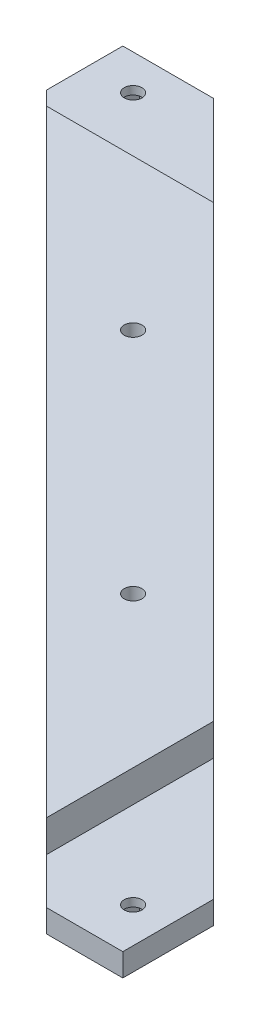
ISO-10303-21;
HEADER;
FILE_DESCRIPTION(('STEP AP214'),'2;1');
FILE_NAME('part.step','',(''),(''),'','','');
FILE_SCHEMA(('AUTOMOTIVE_DESIGN { 1 0 10303 214 1 1 1 1 }'));
ENDSEC;
DATA;
#1=APPLICATION_CONTEXT('core data for automotive mechanical design processes');
#2=APPLICATION_PROTOCOL_DEFINITION('international standard','automotive_design',2000,#1);
#3=PRODUCT_CONTEXT('',#1,'mechanical');
#4=PRODUCT('Part','Part','',(#3));
#5=PRODUCT_RELATED_PRODUCT_CATEGORY('part','',(#4));
#6=PRODUCT_DEFINITION_FORMATION('','',#4);
#7=PRODUCT_DEFINITION_CONTEXT('part definition',#1,'design');
#8=PRODUCT_DEFINITION('design','',#6,#7);
#9=PRODUCT_DEFINITION_SHAPE('','',#8);
#10=(LENGTH_UNIT() NAMED_UNIT(*) SI_UNIT(.MILLI.,.METRE.));
#11=(NAMED_UNIT(*) PLANE_ANGLE_UNIT() SI_UNIT($,.RADIAN.));
#12=(NAMED_UNIT(*) SI_UNIT($,.STERADIAN.) SOLID_ANGLE_UNIT());
#13=UNCERTAINTY_MEASURE_WITH_UNIT(LENGTH_MEASURE(1.E-05),#10,'distance_accuracy_value','');
#14=(GEOMETRIC_REPRESENTATION_CONTEXT(3) GLOBAL_UNCERTAINTY_ASSIGNED_CONTEXT((#13)) GLOBAL_UNIT_ASSIGNED_CONTEXT((#10,
#11,#12)) REPRESENTATION_CONTEXT('',''));
#15=CARTESIAN_POINT('',(0.,0.,0.));
#16=DIRECTION('',(0.,0.,1.));
#17=DIRECTION('',(1.,0.,0.));
#18=AXIS2_PLACEMENT_3D('',#15,#16,#17);
#19=CARTESIAN_POINT('',(0.,12.,0.));
#20=DIRECTION('',(1.,0.,0.));
#21=DIRECTION('',(0.,0.,-1.));
#22=AXIS2_PLACEMENT_3D('',#19,#20,#21);
#23=PLANE('',#22);
#24=DIRECTION('',(0.,1.,0.));
#25=VECTOR('',#24,1.);
#26=CARTESIAN_POINT('',(0.,-310.675688797775,0.25));
#27=LINE('',#26,#25);
#28=CARTESIAN_POINT('',(0.,0.,0.25));
#29=VERTEX_POINT('',#28);
#30=CARTESIAN_POINT('',(0.,5.,0.25));
#31=VERTEX_POINT('',#30);
#32=EDGE_CURVE('E207',#29,#31,#27,.T.);
#33=ORIENTED_EDGE('',*,*,#32,.F.);
#34=DIRECTION('',(0.,0.,1.));
#35=VECTOR('',#34,1.);
#36=CARTESIAN_POINT('',(0.,0.,0.));
#37=LINE('',#36,#35);
#38=CARTESIAN_POINT('',(0.,0.,17.));
#39=VERTEX_POINT('',#38);
#40=EDGE_CURVE('E402',#29,#39,#37,.T.);
#41=ORIENTED_EDGE('',*,*,#40,.T.);
#42=DIRECTION('',(0.,-1.,0.));
#43=VECTOR('',#42,1.);
#44=CARTESIAN_POINT('',(0.,12.,17.));
#45=LINE('',#44,#43);
#46=CARTESIAN_POINT('',(0.,5.,17.));
#47=VERTEX_POINT('',#46);
#48=EDGE_CURVE('E419',#47,#39,#45,.T.);
#49=ORIENTED_EDGE('',*,*,#48,.F.);
#50=DIRECTION('',(0.,0.,1.));
#51=VECTOR('',#50,1.);
#52=CARTESIAN_POINT('',(0.,5.,0.));
#53=LINE('',#52,#51);
#54=EDGE_CURVE('E364',#31,#47,#53,.T.);
#55=ORIENTED_EDGE('',*,*,#54,.F.);
#56=EDGE_LOOP('',(#33,#41,#49,#55));
#57=FACE_BOUND('',#56,.T.);
#58=ADVANCED_FACE('F38',(#57),#23,.F.);
#59=CARTESIAN_POINT('',(0.,12.,0.));
#60=DIRECTION('',(0.,1.,0.));
#61=DIRECTION('',(0.,0.,1.));
#62=AXIS2_PLACEMENT_3D('',#59,#60,#61);
#63=PLANE('',#62);
#64=CARTESIAN_POINT('',(62.0000000000002,12.,60.));
#65=DIRECTION('',(0.,1.,0.));
#66=DIRECTION('',(0.,0.,1.));
#67=AXIS2_PLACEMENT_3D('',#64,#65,#66);
#68=CIRCLE('',#67,1.95);
#69=CARTESIAN_POINT('',(62.0000000000002,12.,61.95));
#70=VERTEX_POINT('',#69);
#71=EDGE_CURVE('E354',#70,#70,#68,.T.);
#72=ORIENTED_EDGE('',*,*,#71,.F.);
#73=EDGE_LOOP('',(#72));
#74=FACE_BOUND('',#73,.T.);
#75=CARTESIAN_POINT('',(112.,12.,110.));
#76=DIRECTION('',(0.,1.,0.));
#77=DIRECTION('',(0.,0.,1.));
#78=AXIS2_PLACEMENT_3D('',#75,#76,#77);
#79=CIRCLE('',#78,1.95);
#80=CARTESIAN_POINT('',(112.,12.,111.95));
#81=VERTEX_POINT('',#80);
#82=EDGE_CURVE('E359',#81,#81,#79,.T.);
#83=ORIENTED_EDGE('',*,*,#82,.F.);
#84=EDGE_LOOP('',(#83));
#85=FACE_BOUND('',#84,.T.);
#86=DIRECTION('',(0.,0.,1.));
#87=VECTOR('',#86,1.);
#88=CARTESIAN_POINT('',(145.,12.,171.999999999999));
#89=LINE('',#88,#87);
#90=CARTESIAN_POINT('',(145.,12.,125.353553390593));
#91=VERTEX_POINT('',#90);
#92=CARTESIAN_POINT('',(145.,12.,161.999999999999));
#93=VERTEX_POINT('',#92);
#94=EDGE_CURVE('E380',#91,#93,#89,.T.);
#95=ORIENTED_EDGE('',*,*,#94,.F.);
#96=DIRECTION('',(-0.707106781186549,0.,-0.707106781186546));
#97=VECTOR('',#96,1.);
#98=CARTESIAN_POINT('',(9.82322330470332,12.,-9.82322330470336));
#99=LINE('',#98,#97);
#100=CARTESIAN_POINT('',(46.6464466094068,12.,27.));
#101=VERTEX_POINT('',#100);
#102=EDGE_CURVE('E453',#91,#101,#99,.T.);
#103=ORIENTED_EDGE('',*,*,#102,.T.);
#104=DIRECTION('',(1.,0.,0.));
#105=VECTOR('',#104,1.);
#106=CARTESIAN_POINT('',(0.,12.,27.));
#107=LINE('',#106,#105);
#108=CARTESIAN_POINT('',(10.0000000000001,12.,27.));
#109=VERTEX_POINT('',#108);
#110=EDGE_CURVE('E368',#109,#101,#107,.T.);
#111=ORIENTED_EDGE('',*,*,#110,.F.);
#112=DIRECTION('',(0.707106781186549,0.,0.707106781186546));
#113=VECTOR('',#112,1.);
#114=CARTESIAN_POINT('',(0.,12.,17.));
#115=LINE('',#114,#113);
#116=EDGE_CURVE('E403',#109,#93,#115,.T.);
#117=ORIENTED_EDGE('',*,*,#116,.T.);
#118=EDGE_LOOP('',(#95,#103,#111,#117));
#119=FACE_BOUND('',#118,.T.);
#120=ADVANCED_FACE('F466',(#74,#85,#119),#63,.T.);
#121=CARTESIAN_POINT('',(0.,0.,0.));
#122=DIRECTION('',(0.,1.,0.));
#123=DIRECTION('',(0.,0.,1.));
#124=AXIS2_PLACEMENT_3D('',#121,#122,#123);
#125=PLANE('',#124);
#126=CARTESIAN_POINT('',(112.,0.,110.));
#127=DIRECTION('',(0.,1.,0.));
#128=DIRECTION('',(0.,0.,1.));
#129=AXIS2_PLACEMENT_3D('',#126,#127,#128);
#130=CIRCLE('',#129,1.95);
#131=CARTESIAN_POINT('',(112.,0.,111.95));
#132=VERTEX_POINT('',#131);
#133=EDGE_CURVE('E358',#132,#132,#130,.F.);
#134=ORIENTED_EDGE('',*,*,#133,.F.);
#135=EDGE_LOOP('',(#134));
#136=FACE_BOUND('',#135,.T.);
#137=CARTESIAN_POINT('',(62.0000000000002,0.,60.));
#138=DIRECTION('',(0.,1.,0.));
#139=DIRECTION('',(0.,0.,1.));
#140=AXIS2_PLACEMENT_3D('',#137,#138,#139);
#141=CIRCLE('',#140,1.95);
#142=CARTESIAN_POINT('',(62.0000000000002,0.,61.95));
#143=VERTEX_POINT('',#142);
#144=EDGE_CURVE('E386',#143,#143,#141,.F.);
#145=ORIENTED_EDGE('',*,*,#144,.F.);
#146=EDGE_LOOP('',(#145));
#147=FACE_BOUND('',#146,.T.);
#148=DIRECTION('',(-0.5,0.,0.866025403784439));
#149=VECTOR('',#148,1.);
#150=CARTESIAN_POINT('',(167.983716857408,0.,161.999999999999));
#151=LINE('',#150,#149);
#152=CARTESIAN_POINT('',(167.983716857409,0.,161.999999999999));
#153=VERTEX_POINT('',#152);
#154=CARTESIAN_POINT('',(165.991858428704,0.,165.449999999999));
#155=VERTEX_POINT('',#154);
#156=EDGE_CURVE('E318',#153,#155,#151,.T.);
#157=ORIENTED_EDGE('',*,*,#156,.F.);
#158=DIRECTION('',(0.500000000000002,0.,0.866025403784437));
#159=VECTOR('',#158,1.);
#160=CARTESIAN_POINT('',(165.991858428704,0.,158.549999999999));
#161=LINE('',#160,#159);
#162=CARTESIAN_POINT('',(165.991858428704,0.,158.549999999999));
#163=VERTEX_POINT('',#162);
#164=EDGE_CURVE('E223',#163,#153,#161,.T.);
#165=ORIENTED_EDGE('',*,*,#164,.F.);
#166=DIRECTION('',(1.,0.,0.));
#167=VECTOR('',#166,1.);
#168=CARTESIAN_POINT('',(162.008141571296,0.,158.549999999999));
#169=LINE('',#168,#167);
#170=CARTESIAN_POINT('',(162.008141571296,0.,158.549999999999));
#171=VERTEX_POINT('',#170);
#172=EDGE_CURVE('E295',#171,#163,#169,.T.);
#173=ORIENTED_EDGE('',*,*,#172,.F.);
#174=DIRECTION('',(0.499999999999998,0.,-0.86602540378444));
#175=VECTOR('',#174,1.);
#176=CARTESIAN_POINT('',(160.016283142592,0.,161.999999999999));
#177=LINE('',#176,#175);
#178=CARTESIAN_POINT('',(160.016283142592,0.,161.999999999999));
#179=VERTEX_POINT('',#178);
#180=EDGE_CURVE('E330',#179,#171,#177,.T.);
#181=ORIENTED_EDGE('',*,*,#180,.F.);
#182=DIRECTION('',(-0.499999999999999,0.,-0.866025403784439));
#183=VECTOR('',#182,1.);
#184=CARTESIAN_POINT('',(162.008141571296,0.,165.449999999999));
#185=LINE('',#184,#183);
#186=CARTESIAN_POINT('',(162.008141571296,0.,165.449999999999));
#187=VERTEX_POINT('',#186);
#188=EDGE_CURVE('E326',#187,#179,#185,.T.);
#189=ORIENTED_EDGE('',*,*,#188,.F.);
#190=DIRECTION('',(-1.,0.,0.));
#191=VECTOR('',#190,1.);
#192=CARTESIAN_POINT('',(165.991858428704,0.,165.449999999999));
#193=LINE('',#192,#191);
#194=EDGE_CURVE('E322',#155,#187,#193,.T.);
#195=ORIENTED_EDGE('',*,*,#194,.F.);
#196=EDGE_LOOP('',(#157,#165,#173,#181,#189,#195));
#197=FACE_BOUND('',#196,.T.);
#198=DIRECTION('',(-0.5,0.,0.866025403784439));
#199=VECTOR('',#198,1.);
#200=CARTESIAN_POINT('',(13.9837168574084,0.,8.));
#201=LINE('',#200,#199);
#202=CARTESIAN_POINT('',(13.9837168574084,0.,8.));
#203=VERTEX_POINT('',#202);
#204=CARTESIAN_POINT('',(11.9918584287042,0.,11.45));
#205=VERTEX_POINT('',#204);
#206=EDGE_CURVE('E252',#203,#205,#201,.T.);
#207=ORIENTED_EDGE('',*,*,#206,.F.);
#208=DIRECTION('',(0.5,0.,0.866025403784439));
#209=VECTOR('',#208,1.);
#210=CARTESIAN_POINT('',(11.9918584287042,0.,4.55));
#211=LINE('',#210,#209);
#212=CARTESIAN_POINT('',(11.9918584287042,0.,4.55));
#213=VERTEX_POINT('',#212);
#214=EDGE_CURVE('E61',#213,#203,#211,.T.);
#215=ORIENTED_EDGE('',*,*,#214,.F.);
#216=DIRECTION('',(1.,0.,0.));
#217=VECTOR('',#216,1.);
#218=CARTESIAN_POINT('',(8.00814157129579,0.,4.55));
#219=LINE('',#218,#217);
#220=CARTESIAN_POINT('',(8.00814157129579,0.,4.55));
#221=VERTEX_POINT('',#220);
#222=EDGE_CURVE('E229',#221,#213,#219,.T.);
#223=ORIENTED_EDGE('',*,*,#222,.F.);
#224=DIRECTION('',(0.5,0.,-0.866025403784439));
#225=VECTOR('',#224,1.);
#226=CARTESIAN_POINT('',(6.01628314259158,0.,8.));
#227=LINE('',#226,#225);
#228=CARTESIAN_POINT('',(6.01628314259158,0.,8.));
#229=VERTEX_POINT('',#228);
#230=EDGE_CURVE('E265',#229,#221,#227,.T.);
#231=ORIENTED_EDGE('',*,*,#230,.F.);
#232=DIRECTION('',(-0.5,0.,-0.866025403784439));
#233=VECTOR('',#232,1.);
#234=CARTESIAN_POINT('',(8.00814157129579,0.,11.45));
#235=LINE('',#234,#233);
#236=CARTESIAN_POINT('',(8.00814157129579,0.,11.45));
#237=VERTEX_POINT('',#236);
#238=EDGE_CURVE('E261',#237,#229,#235,.T.);
#239=ORIENTED_EDGE('',*,*,#238,.F.);
#240=DIRECTION('',(-1.,0.,0.));
#241=VECTOR('',#240,1.);
#242=CARTESIAN_POINT('',(11.9918584287042,0.,11.45));
#243=LINE('',#242,#241);
#244=EDGE_CURVE('E257',#205,#237,#243,.T.);
#245=ORIENTED_EDGE('',*,*,#244,.F.);
#246=EDGE_LOOP('',(#207,#215,#223,#231,#239,#245));
#247=FACE_BOUND('',#246,.T.);
#248=DIRECTION('',(0.,0.,-1.));
#249=VECTOR('',#248,1.);
#250=CARTESIAN_POINT('',(171.75,0.,0.));
#251=LINE('',#250,#249);
#252=CARTESIAN_POINT('',(171.75,0.,171.999999999999));
#253=VERTEX_POINT('',#252);
#254=CARTESIAN_POINT('',(171.75,0.,152.103553390593));
#255=VERTEX_POINT('',#254);
#256=EDGE_CURVE('E187',#253,#255,#251,.T.);
#257=ORIENTED_EDGE('',*,*,#256,.F.);
#258=DIRECTION('',(1.,0.,0.));
#259=VECTOR('',#258,1.);
#260=CARTESIAN_POINT('',(155.,0.,171.999999999999));
#261=LINE('',#260,#259);
#262=CARTESIAN_POINT('',(155.,0.,171.999999999999));
#263=VERTEX_POINT('',#262);
#264=EDGE_CURVE('E408',#263,#253,#261,.T.);
#265=ORIENTED_EDGE('',*,*,#264,.F.);
#266=DIRECTION('',(0.707106781186549,0.,0.707106781186546));
#267=VECTOR('',#266,1.);
#268=CARTESIAN_POINT('',(0.,0.,17.));
#269=LINE('',#268,#267);
#270=EDGE_CURVE('E411',#39,#263,#269,.T.);
#271=ORIENTED_EDGE('',*,*,#270,.F.);
#272=ORIENTED_EDGE('',*,*,#40,.F.);
#273=DIRECTION('',(-1.,0.,0.));
#274=VECTOR('',#273,1.);
#275=CARTESIAN_POINT('',(0.,0.,0.25));
#276=LINE('',#275,#274);
#277=CARTESIAN_POINT('',(19.8964466094067,0.,0.25));
#278=VERTEX_POINT('',#277);
#279=EDGE_CURVE('E199',#278,#29,#276,.T.);
#280=ORIENTED_EDGE('',*,*,#279,.F.);
#281=DIRECTION('',(-0.707106781186549,0.,-0.707106781186546));
#282=VECTOR('',#281,1.);
#283=CARTESIAN_POINT('',(9.82322330470332,0.,-9.82322330470336));
#284=LINE('',#283,#282);
#285=EDGE_CURVE('E200',#255,#278,#284,.T.);
#286=ORIENTED_EDGE('',*,*,#285,.F.);
#287=EDGE_LOOP('',(#257,#265,#271,#272,#280,#286));
#288=FACE_BOUND('',#287,.T.);
#289=ADVANCED_FACE('F210',(#136,#147,#197,#247,#288),#125,.F.);
#290=CARTESIAN_POINT('',(0.,5.,27.));
#291=DIRECTION('',(0.,0.,1.));
#292=DIRECTION('',(1.,0.,0.));
#293=AXIS2_PLACEMENT_3D('',#290,#291,#292);
#294=PLANE('',#293);
#295=DIRECTION('',(0.,1.,0.));
#296=VECTOR('',#295,1.);
#297=CARTESIAN_POINT('',(46.6464466094068,5.,27.));
#298=LINE('',#297,#296);
#299=CARTESIAN_POINT('',(46.6464466094068,5.,27.));
#300=VERTEX_POINT('',#299);
#301=EDGE_CURVE('E217',#300,#101,#298,.T.);
#302=ORIENTED_EDGE('',*,*,#301,.F.);
#303=DIRECTION('',(1.,0.,0.));
#304=VECTOR('',#303,1.);
#305=CARTESIAN_POINT('',(0.,5.,27.));
#306=LINE('',#305,#304);
#307=CARTESIAN_POINT('',(10.0000000000001,5.,27.));
#308=VERTEX_POINT('',#307);
#309=EDGE_CURVE('E367',#308,#300,#306,.T.);
#310=ORIENTED_EDGE('',*,*,#309,.F.);
#311=DIRECTION('',(0.,-1.,0.));
#312=VECTOR('',#311,1.);
#313=CARTESIAN_POINT('',(10.0000000000001,12.,27.));
#314=LINE('',#313,#312);
#315=EDGE_CURVE('E398',#109,#308,#314,.T.);
#316=ORIENTED_EDGE('',*,*,#315,.F.);
#317=ORIENTED_EDGE('',*,*,#110,.T.);
#318=EDGE_LOOP('',(#302,#310,#316,#317));
#319=FACE_BOUND('',#318,.T.);
#320=ADVANCED_FACE('F468',(#319),#294,.F.);
#321=CARTESIAN_POINT('',(0.,5.,0.));
#322=DIRECTION('',(0.,1.,0.));
#323=DIRECTION('',(0.,0.,1.));
#324=AXIS2_PLACEMENT_3D('',#321,#322,#323);
#325=PLANE('',#324);
#326=CARTESIAN_POINT('',(10.,5.,8.));
#327=DIRECTION('',(0.,1.,0.));
#328=DIRECTION('',(0.,0.,1.));
#329=AXIS2_PLACEMENT_3D('',#326,#327,#328);
#330=CIRCLE('',#329,1.95);
#331=CARTESIAN_POINT('',(10.,5.,9.95));
#332=VERTEX_POINT('',#331);
#333=EDGE_CURVE('E372',#332,#332,#330,.F.);
#334=ORIENTED_EDGE('',*,*,#333,.T.);
#335=EDGE_LOOP('',(#334));
#336=FACE_BOUND('',#335,.T.);
#337=ORIENTED_EDGE('',*,*,#309,.T.);
#338=DIRECTION('',(-0.707106781186549,0.,-0.707106781186546));
#339=VECTOR('',#338,1.);
#340=CARTESIAN_POINT('',(9.82322330470332,5.,-9.82322330470336));
#341=LINE('',#340,#339);
#342=CARTESIAN_POINT('',(19.8964466094067,5.,0.25));
#343=VERTEX_POINT('',#342);
#344=EDGE_CURVE('E213',#300,#343,#341,.T.);
#345=ORIENTED_EDGE('',*,*,#344,.T.);
#346=DIRECTION('',(-1.,0.,0.));
#347=VECTOR('',#346,1.);
#348=CARTESIAN_POINT('',(0.,5.,0.25));
#349=LINE('',#348,#347);
#350=EDGE_CURVE('E11',#343,#31,#349,.T.);
#351=ORIENTED_EDGE('',*,*,#350,.T.);
#352=ORIENTED_EDGE('',*,*,#54,.T.);
#353=DIRECTION('',(0.707106781186549,0.,0.707106781186546));
#354=VECTOR('',#353,1.);
#355=CARTESIAN_POINT('',(0.,5.,17.));
#356=LINE('',#355,#354);
#357=EDGE_CURVE('E387',#47,#308,#356,.T.);
#358=ORIENTED_EDGE('',*,*,#357,.T.);
#359=EDGE_LOOP('',(#337,#345,#351,#352,#358));
#360=FACE_BOUND('',#359,.T.);
#361=ADVANCED_FACE('F478',(#336,#360),#325,.T.);
#362=CARTESIAN_POINT('',(145.,5.,171.999999999999));
#363=DIRECTION('',(-1.,0.,0.));
#364=DIRECTION('',(0.,0.,1.));
#365=AXIS2_PLACEMENT_3D('',#362,#363,#364);
#366=PLANE('',#365);
#367=DIRECTION('',(0.,-1.,0.));
#368=VECTOR('',#367,1.);
#369=CARTESIAN_POINT('',(145.,5.,125.353553390593));
#370=LINE('',#369,#368);
#371=CARTESIAN_POINT('',(145.,5.,125.353553390593));
#372=VERTEX_POINT('',#371);
#373=EDGE_CURVE('E53',#91,#372,#370,.T.);
#374=ORIENTED_EDGE('',*,*,#373,.F.);
#375=ORIENTED_EDGE('',*,*,#94,.T.);
#376=DIRECTION('',(0.,1.,0.));
#377=VECTOR('',#376,1.);
#378=CARTESIAN_POINT('',(145.,12.,161.999999999999));
#379=LINE('',#378,#377);
#380=CARTESIAN_POINT('',(145.,5.,161.999999999999));
#381=VERTEX_POINT('',#380);
#382=EDGE_CURVE('E394',#381,#93,#379,.T.);
#383=ORIENTED_EDGE('',*,*,#382,.F.);
#384=DIRECTION('',(0.,0.,1.));
#385=VECTOR('',#384,1.);
#386=CARTESIAN_POINT('',(145.,5.,171.999999999999));
#387=LINE('',#386,#385);
#388=EDGE_CURVE('E377',#372,#381,#387,.T.);
#389=ORIENTED_EDGE('',*,*,#388,.F.);
#390=EDGE_LOOP('',(#374,#375,#383,#389));
#391=FACE_BOUND('',#390,.T.);
#392=ADVANCED_FACE('F476',(#391),#366,.F.);
#393=CARTESIAN_POINT('',(0.,5.,0.));
#394=DIRECTION('',(0.,1.,0.));
#395=DIRECTION('',(0.,0.,1.));
#396=AXIS2_PLACEMENT_3D('',#393,#394,#395);
#397=PLANE('',#396);
#398=CARTESIAN_POINT('',(164.,5.,161.999999999999));
#399=DIRECTION('',(0.,1.,0.));
#400=DIRECTION('',(0.,0.,1.));
#401=AXIS2_PLACEMENT_3D('',#398,#399,#400);
#402=CIRCLE('',#401,1.95);
#403=CARTESIAN_POINT('',(164.,5.,163.949999999999));
#404=VERTEX_POINT('',#403);
#405=EDGE_CURVE('E390',#404,#404,#402,.F.);
#406=ORIENTED_EDGE('',*,*,#405,.T.);
#407=EDGE_LOOP('',(#406));
#408=FACE_BOUND('',#407,.T.);
#409=DIRECTION('',(1.,0.,0.));
#410=VECTOR('',#409,1.);
#411=CARTESIAN_POINT('',(172.,5.,171.999999999999));
#412=LINE('',#411,#410);
#413=CARTESIAN_POINT('',(155.,5.,171.999999999999));
#414=VERTEX_POINT('',#413);
#415=CARTESIAN_POINT('',(171.75,5.,171.999999999999));
#416=VERTEX_POINT('',#415);
#417=EDGE_CURVE('E376',#414,#416,#412,.T.);
#418=ORIENTED_EDGE('',*,*,#417,.T.);
#419=DIRECTION('',(0.,0.,-1.));
#420=VECTOR('',#419,1.);
#421=CARTESIAN_POINT('',(171.75,5.,0.));
#422=LINE('',#421,#420);
#423=CARTESIAN_POINT('',(171.75,5.,152.103553390593));
#424=VERTEX_POINT('',#423);
#425=EDGE_CURVE('E46',#416,#424,#422,.T.);
#426=ORIENTED_EDGE('',*,*,#425,.T.);
#427=DIRECTION('',(-0.707106781186549,0.,-0.707106781186546));
#428=VECTOR('',#427,1.);
#429=CARTESIAN_POINT('',(9.82322330470332,5.,-9.82322330470336));
#430=LINE('',#429,#428);
#431=EDGE_CURVE('E205',#424,#372,#430,.T.);
#432=ORIENTED_EDGE('',*,*,#431,.T.);
#433=ORIENTED_EDGE('',*,*,#388,.T.);
#434=DIRECTION('',(0.707106781186549,0.,0.707106781186546));
#435=VECTOR('',#434,1.);
#436=CARTESIAN_POINT('',(0.,5.,17.));
#437=LINE('',#436,#435);
#438=EDGE_CURVE('E391',#381,#414,#437,.T.);
#439=ORIENTED_EDGE('',*,*,#438,.T.);
#440=EDGE_LOOP('',(#418,#426,#432,#433,#439));
#441=FACE_BOUND('',#440,.T.);
#442=ADVANCED_FACE('F444',(#408,#441),#397,.T.);
#443=CARTESIAN_POINT('',(164.,0.,161.999999999999));
#444=DIRECTION('',(0.,1.,0.));
#445=DIRECTION('',(0.,0.,1.));
#446=AXIS2_PLACEMENT_3D('',#443,#444,#445);
#447=CYLINDRICAL_SURFACE('',#446,1.95);
#448=ORIENTED_EDGE('',*,*,#405,.F.);
#449=EDGE_LOOP('',(#448));
#450=FACE_BOUND('',#449,.T.);
#451=CARTESIAN_POINT('',(164.,3.2,161.999999999999));
#452=DIRECTION('',(0.,-1.,0.));
#453=DIRECTION('',(0.,0.,-1.));
#454=AXIS2_PLACEMENT_3D('',#451,#452,#453);
#455=CIRCLE('',#454,1.95);
#456=CARTESIAN_POINT('',(164.,3.2,160.049999999999));
#457=VERTEX_POINT('',#456);
#458=EDGE_CURVE('E363',#457,#457,#455,.F.);
#459=ORIENTED_EDGE('',*,*,#458,.F.);
#460=EDGE_LOOP('',(#459));
#461=FACE_BOUND('',#460,.T.);
#462=ADVANCED_FACE('F484',(#450,#461),#447,.F.);
#463=CARTESIAN_POINT('',(10.,0.,8.));
#464=DIRECTION('',(0.,1.,0.));
#465=DIRECTION('',(0.,0.,1.));
#466=AXIS2_PLACEMENT_3D('',#463,#464,#465);
#467=CYLINDRICAL_SURFACE('',#466,1.95);
#468=ORIENTED_EDGE('',*,*,#333,.F.);
#469=EDGE_LOOP('',(#468));
#470=FACE_BOUND('',#469,.T.);
#471=CARTESIAN_POINT('',(10.,3.2,8.));
#472=DIRECTION('',(0.,-1.,0.));
#473=DIRECTION('',(0.,0.,-1.));
#474=AXIS2_PLACEMENT_3D('',#471,#472,#473);
#475=CIRCLE('',#474,1.95);
#476=CARTESIAN_POINT('',(10.,3.2,6.05));
#477=VERTEX_POINT('',#476);
#478=EDGE_CURVE('E275',#477,#477,#475,.F.);
#479=ORIENTED_EDGE('',*,*,#478,.F.);
#480=EDGE_LOOP('',(#479));
#481=FACE_BOUND('',#480,.T.);
#482=ADVANCED_FACE('F593',(#470,#481),#467,.F.);
#483=CARTESIAN_POINT('',(155.,12.,171.999999999999));
#484=DIRECTION('',(0.,0.,-1.));
#485=DIRECTION('',(-1.,0.,0.));
#486=AXIS2_PLACEMENT_3D('',#483,#484,#485);
#487=PLANE('',#486);
#488=ORIENTED_EDGE('',*,*,#264,.T.);
#489=DIRECTION('',(0.,1.,0.));
#490=VECTOR('',#489,1.);
#491=CARTESIAN_POINT('',(171.75,-310.675688797775,171.999999999999));
#492=LINE('',#491,#490);
#493=EDGE_CURVE('E193',#253,#416,#492,.T.);
#494=ORIENTED_EDGE('',*,*,#493,.T.);
#495=ORIENTED_EDGE('',*,*,#417,.F.);
#496=DIRECTION('',(0.,-1.,0.));
#497=VECTOR('',#496,1.);
#498=CARTESIAN_POINT('',(155.,12.,171.999999999999));
#499=LINE('',#498,#497);
#500=EDGE_CURVE('E407',#414,#263,#499,.T.);
#501=ORIENTED_EDGE('',*,*,#500,.T.);
#502=EDGE_LOOP('',(#488,#494,#495,#501));
#503=FACE_BOUND('',#502,.T.);
#504=ADVANCED_FACE('F448',(#503),#487,.F.);
#505=CARTESIAN_POINT('',(0.,12.,17.));
#506=DIRECTION('',(0.707106781186546,0.,-0.707106781186549));
#507=DIRECTION('',(-0.707106781186549,0.,-0.707106781186546));
#508=AXIS2_PLACEMENT_3D('',#505,#506,#507);
#509=PLANE('',#508);
#510=ORIENTED_EDGE('',*,*,#116,.F.);
#511=ORIENTED_EDGE('',*,*,#315,.T.);
#512=ORIENTED_EDGE('',*,*,#357,.F.);
#513=ORIENTED_EDGE('',*,*,#48,.T.);
#514=ORIENTED_EDGE('',*,*,#270,.T.);
#515=ORIENTED_EDGE('',*,*,#500,.F.);
#516=ORIENTED_EDGE('',*,*,#438,.F.);
#517=ORIENTED_EDGE('',*,*,#382,.T.);
#518=EDGE_LOOP('',(#510,#511,#512,#513,#514,#515,#516,#517));
#519=FACE_BOUND('',#518,.T.);
#520=ADVANCED_FACE('F471',(#519),#509,.F.);
#521=CARTESIAN_POINT('',(112.,12.,110.));
#522=DIRECTION('',(0.,-1.,0.));
#523=DIRECTION('',(0.,0.,-1.));
#524=AXIS2_PLACEMENT_3D('',#521,#522,#523);
#525=CYLINDRICAL_SURFACE('',#524,1.95);
#526=ORIENTED_EDGE('',*,*,#82,.T.);
#527=EDGE_LOOP('',(#526));
#528=FACE_BOUND('',#527,.T.);
#529=ORIENTED_EDGE('',*,*,#133,.T.);
#530=EDGE_LOOP('',(#529));
#531=FACE_BOUND('',#530,.T.);
#532=ADVANCED_FACE('F575',(#528,#531),#525,.F.);
#533=CARTESIAN_POINT('',(62.0000000000002,12.,60.));
#534=DIRECTION('',(0.,-1.,0.));
#535=DIRECTION('',(0.,0.,-1.));
#536=AXIS2_PLACEMENT_3D('',#533,#534,#535);
#537=CYLINDRICAL_SURFACE('',#536,1.95);
#538=ORIENTED_EDGE('',*,*,#71,.T.);
#539=EDGE_LOOP('',(#538));
#540=FACE_BOUND('',#539,.T.);
#541=ORIENTED_EDGE('',*,*,#144,.T.);
#542=EDGE_LOOP('',(#541));
#543=FACE_BOUND('',#542,.T.);
#544=ADVANCED_FACE('F549',(#540,#543),#537,.F.);
#545=CARTESIAN_POINT('',(0.,3.2,0.));
#546=DIRECTION('',(0.,-1.,0.));
#547=DIRECTION('',(0.,0.,-1.));
#548=AXIS2_PLACEMENT_3D('',#545,#546,#547);
#549=PLANE('',#548);
#550=DIRECTION('',(0.500000000000002,0.,0.866025403784437));
#551=VECTOR('',#550,1.);
#552=CARTESIAN_POINT('',(165.991858428704,3.2,158.549999999999));
#553=LINE('',#552,#551);
#554=CARTESIAN_POINT('',(165.991858428704,3.2,158.549999999999));
#555=VERTEX_POINT('',#554);
#556=CARTESIAN_POINT('',(167.983716857408,3.2,161.999999999999));
#557=VERTEX_POINT('',#556);
#558=EDGE_CURVE('E290',#555,#557,#553,.T.);
#559=ORIENTED_EDGE('',*,*,#558,.T.);
#560=DIRECTION('',(-0.5,0.,0.866025403784439));
#561=VECTOR('',#560,1.);
#562=CARTESIAN_POINT('',(167.983716857408,3.2,161.999999999999));
#563=LINE('',#562,#561);
#564=CARTESIAN_POINT('',(165.991858428704,3.2,165.449999999999));
#565=VERTEX_POINT('',#564);
#566=EDGE_CURVE('E294',#557,#565,#563,.T.);
#567=ORIENTED_EDGE('',*,*,#566,.T.);
#568=DIRECTION('',(-1.,0.,0.));
#569=VECTOR('',#568,1.);
#570=CARTESIAN_POINT('',(165.991858428704,3.2,165.449999999999));
#571=LINE('',#570,#569);
#572=CARTESIAN_POINT('',(162.008141571296,3.2,165.449999999999));
#573=VERTEX_POINT('',#572);
#574=EDGE_CURVE('E299',#565,#573,#571,.T.);
#575=ORIENTED_EDGE('',*,*,#574,.T.);
#576=DIRECTION('',(-0.499999999999999,0.,-0.866025403784439));
#577=VECTOR('',#576,1.);
#578=CARTESIAN_POINT('',(162.008141571296,3.2,165.449999999999));
#579=LINE('',#578,#577);
#580=CARTESIAN_POINT('',(160.016283142592,3.2,161.999999999999));
#581=VERTEX_POINT('',#580);
#582=EDGE_CURVE('E303',#573,#581,#579,.T.);
#583=ORIENTED_EDGE('',*,*,#582,.T.);
#584=DIRECTION('',(0.499999999999998,0.,-0.86602540378444));
#585=VECTOR('',#584,1.);
#586=CARTESIAN_POINT('',(160.016283142592,3.2,161.999999999999));
#587=LINE('',#586,#585);
#588=CARTESIAN_POINT('',(162.008141571296,3.2,158.549999999999));
#589=VERTEX_POINT('',#588);
#590=EDGE_CURVE('E307',#581,#589,#587,.T.);
#591=ORIENTED_EDGE('',*,*,#590,.T.);
#592=DIRECTION('',(1.,0.,0.));
#593=VECTOR('',#592,1.);
#594=CARTESIAN_POINT('',(162.008141571296,3.2,158.549999999999));
#595=LINE('',#594,#593);
#596=EDGE_CURVE('E311',#589,#555,#595,.T.);
#597=ORIENTED_EDGE('',*,*,#596,.T.);
#598=EDGE_LOOP('',(#559,#567,#575,#583,#591,#597));
#599=FACE_BOUND('',#598,.T.);
#600=ORIENTED_EDGE('',*,*,#458,.T.);
#601=EDGE_LOOP('',(#600));
#602=FACE_BOUND('',#601,.T.);
#603=ADVANCED_FACE('F545',(#599,#602),#549,.T.);
#604=CARTESIAN_POINT('',(165.991858428704,3.2,158.549999999999));
#605=DIRECTION('',(0.866025403784438,0.,-0.500000000000002));
#606=DIRECTION('',(-0.500000000000002,0.,-0.866025403784438));
#607=AXIS2_PLACEMENT_3D('',#604,#605,#606);
#608=PLANE('',#607);
#609=ORIENTED_EDGE('',*,*,#164,.T.);
#610=DIRECTION('',(0.,-1.,0.));
#611=VECTOR('',#610,1.);
#612=CARTESIAN_POINT('',(167.983716857408,3.2,161.999999999999));
#613=LINE('',#612,#611);
#614=EDGE_CURVE('E315',#557,#153,#613,.T.);
#615=ORIENTED_EDGE('',*,*,#614,.F.);
#616=ORIENTED_EDGE('',*,*,#558,.F.);
#617=DIRECTION('',(0.,-1.,0.));
#618=VECTOR('',#617,1.);
#619=CARTESIAN_POINT('',(165.991858428704,3.2,158.549999999999));
#620=LINE('',#619,#618);
#621=EDGE_CURVE('E253',#555,#163,#620,.T.);
#622=ORIENTED_EDGE('',*,*,#621,.T.);
#623=EDGE_LOOP('',(#609,#615,#616,#622));
#624=FACE_BOUND('',#623,.T.);
#625=ADVANCED_FACE('F548',(#624),#608,.F.);
#626=CARTESIAN_POINT('',(162.008141571296,3.2,158.549999999999));
#627=DIRECTION('',(0.,0.,-1.));
#628=DIRECTION('',(-1.,0.,0.));
#629=AXIS2_PLACEMENT_3D('',#626,#627,#628);
#630=PLANE('',#629);
#631=ORIENTED_EDGE('',*,*,#172,.T.);
#632=ORIENTED_EDGE('',*,*,#621,.F.);
#633=ORIENTED_EDGE('',*,*,#596,.F.);
#634=DIRECTION('',(0.,-1.,0.));
#635=VECTOR('',#634,1.);
#636=CARTESIAN_POINT('',(162.008141571296,3.2,158.549999999999));
#637=LINE('',#636,#635);
#638=EDGE_CURVE('E339',#589,#171,#637,.T.);
#639=ORIENTED_EDGE('',*,*,#638,.T.);
#640=EDGE_LOOP('',(#631,#632,#633,#639));
#641=FACE_BOUND('',#640,.T.);
#642=ADVANCED_FACE('F551',(#641),#630,.F.);
#643=CARTESIAN_POINT('',(160.016283142592,3.2,161.999999999999));
#644=DIRECTION('',(-0.86602540378444,0.,-0.499999999999998));
#645=DIRECTION('',(-0.499999999999998,0.,0.86602540378444));
#646=AXIS2_PLACEMENT_3D('',#643,#644,#645);
#647=PLANE('',#646);
#648=ORIENTED_EDGE('',*,*,#180,.T.);
#649=ORIENTED_EDGE('',*,*,#638,.F.);
#650=ORIENTED_EDGE('',*,*,#590,.F.);
#651=DIRECTION('',(0.,-1.,0.));
#652=VECTOR('',#651,1.);
#653=CARTESIAN_POINT('',(160.016283142592,3.2,161.999999999999));
#654=LINE('',#653,#652);
#655=EDGE_CURVE('E342',#581,#179,#654,.T.);
#656=ORIENTED_EDGE('',*,*,#655,.T.);
#657=EDGE_LOOP('',(#648,#649,#650,#656));
#658=FACE_BOUND('',#657,.T.);
#659=ADVANCED_FACE('F554',(#658),#647,.F.);
#660=CARTESIAN_POINT('',(162.008141571296,3.2,165.449999999999));
#661=DIRECTION('',(-0.866025403784439,0.,0.499999999999999));
#662=DIRECTION('',(0.499999999999999,0.,0.866025403784439));
#663=AXIS2_PLACEMENT_3D('',#660,#661,#662);
#664=PLANE('',#663);
#665=ORIENTED_EDGE('',*,*,#188,.T.);
#666=ORIENTED_EDGE('',*,*,#655,.F.);
#667=ORIENTED_EDGE('',*,*,#582,.F.);
#668=DIRECTION('',(0.,-1.,0.));
#669=VECTOR('',#668,1.);
#670=CARTESIAN_POINT('',(162.008141571296,3.2,165.449999999999));
#671=LINE('',#670,#669);
#672=EDGE_CURVE('E345',#573,#187,#671,.T.);
#673=ORIENTED_EDGE('',*,*,#672,.T.);
#674=EDGE_LOOP('',(#665,#666,#667,#673));
#675=FACE_BOUND('',#674,.T.);
#676=ADVANCED_FACE('F558',(#675),#664,.F.);
#677=CARTESIAN_POINT('',(165.991858428704,3.2,165.449999999999));
#678=DIRECTION('',(0.,0.,1.));
#679=DIRECTION('',(1.,0.,0.));
#680=AXIS2_PLACEMENT_3D('',#677,#678,#679);
#681=PLANE('',#680);
#682=ORIENTED_EDGE('',*,*,#194,.T.);
#683=ORIENTED_EDGE('',*,*,#672,.F.);
#684=ORIENTED_EDGE('',*,*,#574,.F.);
#685=DIRECTION('',(0.,-1.,0.));
#686=VECTOR('',#685,1.);
#687=CARTESIAN_POINT('',(165.991858428704,3.2,165.449999999999));
#688=LINE('',#687,#686);
#689=EDGE_CURVE('E348',#565,#155,#688,.T.);
#690=ORIENTED_EDGE('',*,*,#689,.T.);
#691=EDGE_LOOP('',(#682,#683,#684,#690));
#692=FACE_BOUND('',#691,.T.);
#693=ADVANCED_FACE('F562',(#692),#681,.F.);
#694=CARTESIAN_POINT('',(167.983716857408,3.2,161.999999999999));
#695=DIRECTION('',(0.866025403784439,0.,0.5));
#696=DIRECTION('',(0.5,0.,-0.866025403784439));
#697=AXIS2_PLACEMENT_3D('',#694,#695,#696);
#698=PLANE('',#697);
#699=ORIENTED_EDGE('',*,*,#156,.T.);
#700=ORIENTED_EDGE('',*,*,#689,.F.);
#701=ORIENTED_EDGE('',*,*,#566,.F.);
#702=ORIENTED_EDGE('',*,*,#614,.T.);
#703=EDGE_LOOP('',(#699,#700,#701,#702));
#704=FACE_BOUND('',#703,.T.);
#705=ADVANCED_FACE('F526',(#704),#698,.F.);
#706=CARTESIAN_POINT('',(0.,3.2,0.));
#707=DIRECTION('',(0.,-1.,0.));
#708=DIRECTION('',(0.,0.,-1.));
#709=AXIS2_PLACEMENT_3D('',#706,#707,#708);
#710=PLANE('',#709);
#711=DIRECTION('',(0.5,0.,0.866025403784439));
#712=VECTOR('',#711,1.);
#713=CARTESIAN_POINT('',(11.9918584287042,3.2,4.55));
#714=LINE('',#713,#712);
#715=CARTESIAN_POINT('',(11.9918584287042,3.2,4.55));
#716=VERTEX_POINT('',#715);
#717=CARTESIAN_POINT('',(13.9837168574084,3.2,8.));
#718=VERTEX_POINT('',#717);
#719=EDGE_CURVE('E224',#716,#718,#714,.T.);
#720=ORIENTED_EDGE('',*,*,#719,.T.);
#721=DIRECTION('',(-0.5,0.,0.866025403784439));
#722=VECTOR('',#721,1.);
#723=CARTESIAN_POINT('',(13.9837168574084,3.2,8.));
#724=LINE('',#723,#722);
#725=CARTESIAN_POINT('',(11.9918584287042,3.2,11.45));
#726=VERTEX_POINT('',#725);
#727=EDGE_CURVE('E228',#718,#726,#724,.T.);
#728=ORIENTED_EDGE('',*,*,#727,.T.);
#729=DIRECTION('',(-1.,0.,0.));
#730=VECTOR('',#729,1.);
#731=CARTESIAN_POINT('',(11.9918584287042,3.2,11.45));
#732=LINE('',#731,#730);
#733=CARTESIAN_POINT('',(8.00814157129579,3.2,11.45));
#734=VERTEX_POINT('',#733);
#735=EDGE_CURVE('E233',#726,#734,#732,.T.);
#736=ORIENTED_EDGE('',*,*,#735,.T.);
#737=DIRECTION('',(-0.5,0.,-0.866025403784439));
#738=VECTOR('',#737,1.);
#739=CARTESIAN_POINT('',(8.00814157129579,3.2,11.45));
#740=LINE('',#739,#738);
#741=CARTESIAN_POINT('',(6.01628314259158,3.2,8.));
#742=VERTEX_POINT('',#741);
#743=EDGE_CURVE('E237',#734,#742,#740,.T.);
#744=ORIENTED_EDGE('',*,*,#743,.T.);
#745=DIRECTION('',(0.5,0.,-0.866025403784439));
#746=VECTOR('',#745,1.);
#747=CARTESIAN_POINT('',(6.01628314259158,3.2,8.));
#748=LINE('',#747,#746);
#749=CARTESIAN_POINT('',(8.00814157129579,3.2,4.55));
#750=VERTEX_POINT('',#749);
#751=EDGE_CURVE('E241',#742,#750,#748,.T.);
#752=ORIENTED_EDGE('',*,*,#751,.T.);
#753=DIRECTION('',(1.,0.,0.));
#754=VECTOR('',#753,1.);
#755=CARTESIAN_POINT('',(8.00814157129579,3.2,4.55));
#756=LINE('',#755,#754);
#757=EDGE_CURVE('E245',#750,#716,#756,.T.);
#758=ORIENTED_EDGE('',*,*,#757,.T.);
#759=EDGE_LOOP('',(#720,#728,#736,#744,#752,#758));
#760=FACE_BOUND('',#759,.T.);
#761=ORIENTED_EDGE('',*,*,#478,.T.);
#762=EDGE_LOOP('',(#761));
#763=FACE_BOUND('',#762,.T.);
#764=ADVANCED_FACE('F522',(#760,#763),#710,.T.);
#765=CARTESIAN_POINT('',(11.9918584287042,3.2,4.55));
#766=DIRECTION('',(0.866025403784439,0.,-0.5));
#767=DIRECTION('',(-0.5,0.,-0.866025403784439));
#768=AXIS2_PLACEMENT_3D('',#765,#766,#767);
#769=PLANE('',#768);
#770=ORIENTED_EDGE('',*,*,#214,.T.);
#771=DIRECTION('',(0.,-1.,0.));
#772=VECTOR('',#771,1.);
#773=CARTESIAN_POINT('',(13.9837168574084,3.2,8.));
#774=LINE('',#773,#772);
#775=EDGE_CURVE('E249',#718,#203,#774,.T.);
#776=ORIENTED_EDGE('',*,*,#775,.F.);
#777=ORIENTED_EDGE('',*,*,#719,.F.);
#778=DIRECTION('',(0.,-1.,0.));
#779=VECTOR('',#778,1.);
#780=CARTESIAN_POINT('',(11.9918584287042,3.2,4.55));
#781=LINE('',#780,#779);
#782=EDGE_CURVE('E272',#716,#213,#781,.T.);
#783=ORIENTED_EDGE('',*,*,#782,.T.);
#784=EDGE_LOOP('',(#770,#776,#777,#783));
#785=FACE_BOUND('',#784,.T.);
#786=ADVANCED_FACE('F525',(#785),#769,.F.);
#787=CARTESIAN_POINT('',(8.00814157129579,3.2,4.55));
#788=DIRECTION('',(0.,0.,-1.));
#789=DIRECTION('',(-1.,0.,0.));
#790=AXIS2_PLACEMENT_3D('',#787,#788,#789);
#791=PLANE('',#790);
#792=ORIENTED_EDGE('',*,*,#222,.T.);
#793=ORIENTED_EDGE('',*,*,#782,.F.);
#794=ORIENTED_EDGE('',*,*,#757,.F.);
#795=DIRECTION('',(0.,-1.,0.));
#796=VECTOR('',#795,1.);
#797=CARTESIAN_POINT('',(8.00814157129579,3.2,4.55));
#798=LINE('',#797,#796);
#799=EDGE_CURVE('E276',#750,#221,#798,.T.);
#800=ORIENTED_EDGE('',*,*,#799,.T.);
#801=EDGE_LOOP('',(#792,#793,#794,#800));
#802=FACE_BOUND('',#801,.T.);
#803=ADVANCED_FACE('F528',(#802),#791,.F.);
#804=CARTESIAN_POINT('',(6.01628314259158,3.2,8.));
#805=DIRECTION('',(-0.866025403784439,0.,-0.5));
#806=DIRECTION('',(-0.5,0.,0.866025403784439));
#807=AXIS2_PLACEMENT_3D('',#804,#805,#806);
#808=PLANE('',#807);
#809=ORIENTED_EDGE('',*,*,#230,.T.);
#810=ORIENTED_EDGE('',*,*,#799,.F.);
#811=ORIENTED_EDGE('',*,*,#751,.F.);
#812=DIRECTION('',(0.,-1.,0.));
#813=VECTOR('',#812,1.);
#814=CARTESIAN_POINT('',(6.01628314259158,3.2,8.));
#815=LINE('',#814,#813);
#816=EDGE_CURVE('E279',#742,#229,#815,.T.);
#817=ORIENTED_EDGE('',*,*,#816,.T.);
#818=EDGE_LOOP('',(#809,#810,#811,#817));
#819=FACE_BOUND('',#818,.T.);
#820=ADVANCED_FACE('F531',(#819),#808,.F.);
#821=CARTESIAN_POINT('',(8.00814157129579,3.2,11.45));
#822=DIRECTION('',(-0.866025403784439,0.,0.5));
#823=DIRECTION('',(0.5,0.,0.866025403784439));
#824=AXIS2_PLACEMENT_3D('',#821,#822,#823);
#825=PLANE('',#824);
#826=ORIENTED_EDGE('',*,*,#238,.T.);
#827=ORIENTED_EDGE('',*,*,#816,.F.);
#828=ORIENTED_EDGE('',*,*,#743,.F.);
#829=DIRECTION('',(0.,-1.,0.));
#830=VECTOR('',#829,1.);
#831=CARTESIAN_POINT('',(8.00814157129579,3.2,11.45));
#832=LINE('',#831,#830);
#833=EDGE_CURVE('E282',#734,#237,#832,.T.);
#834=ORIENTED_EDGE('',*,*,#833,.T.);
#835=EDGE_LOOP('',(#826,#827,#828,#834));
#836=FACE_BOUND('',#835,.T.);
#837=ADVANCED_FACE('F535',(#836),#825,.F.);
#838=CARTESIAN_POINT('',(11.9918584287042,3.2,11.45));
#839=DIRECTION('',(0.,0.,1.));
#840=DIRECTION('',(1.,0.,0.));
#841=AXIS2_PLACEMENT_3D('',#838,#839,#840);
#842=PLANE('',#841);
#843=ORIENTED_EDGE('',*,*,#244,.T.);
#844=ORIENTED_EDGE('',*,*,#833,.F.);
#845=ORIENTED_EDGE('',*,*,#735,.F.);
#846=DIRECTION('',(0.,-1.,0.));
#847=VECTOR('',#846,1.);
#848=CARTESIAN_POINT('',(11.9918584287042,3.2,11.45));
#849=LINE('',#848,#847);
#850=EDGE_CURVE('E285',#726,#205,#849,.T.);
#851=ORIENTED_EDGE('',*,*,#850,.T.);
#852=EDGE_LOOP('',(#843,#844,#845,#851));
#853=FACE_BOUND('',#852,.T.);
#854=ADVANCED_FACE('F516',(#853),#842,.F.);
#855=CARTESIAN_POINT('',(13.9837168574084,3.2,8.));
#856=DIRECTION('',(0.866025403784439,0.,0.5));
#857=DIRECTION('',(0.5,0.,-0.866025403784439));
#858=AXIS2_PLACEMENT_3D('',#855,#856,#857);
#859=PLANE('',#858);
#860=ORIENTED_EDGE('',*,*,#206,.T.);
#861=ORIENTED_EDGE('',*,*,#850,.F.);
#862=ORIENTED_EDGE('',*,*,#727,.F.);
#863=ORIENTED_EDGE('',*,*,#775,.T.);
#864=EDGE_LOOP('',(#860,#861,#862,#863));
#865=FACE_BOUND('',#864,.T.);
#866=ADVANCED_FACE('F509',(#865),#859,.F.);
#867=CARTESIAN_POINT('',(19.8964466094067,-310.675688797775,0.25));
#868=DIRECTION('',(0.,0.,-1.));
#869=DIRECTION('',(-1.,0.,0.));
#870=AXIS2_PLACEMENT_3D('',#867,#868,#869);
#871=PLANE('',#870);
#872=DIRECTION('',(0.,1.,0.));
#873=VECTOR('',#872,1.);
#874=CARTESIAN_POINT('',(19.8964466094067,-310.675688797775,0.25));
#875=LINE('',#874,#873);
#876=EDGE_CURVE('E502',#278,#343,#875,.T.);
#877=ORIENTED_EDGE('',*,*,#876,.F.);
#878=ORIENTED_EDGE('',*,*,#279,.T.);
#879=ORIENTED_EDGE('',*,*,#32,.T.);
#880=ORIENTED_EDGE('',*,*,#350,.F.);
#881=EDGE_LOOP('',(#877,#878,#879,#880));
#882=FACE_BOUND('',#881,.T.);
#883=ADVANCED_FACE('F507',(#882),#871,.T.);
#884=CARTESIAN_POINT('',(171.75,-310.675688797775,171.999999999999));
#885=DIRECTION('',(1.,0.,0.));
#886=DIRECTION('',(0.,0.,-1.));
#887=AXIS2_PLACEMENT_3D('',#884,#885,#886);
#888=PLANE('',#887);
#889=ORIENTED_EDGE('',*,*,#493,.F.);
#890=ORIENTED_EDGE('',*,*,#256,.T.);
#891=DIRECTION('',(0.,1.,0.));
#892=VECTOR('',#891,1.);
#893=CARTESIAN_POINT('',(171.75,-310.675688797775,152.103553390593));
#894=LINE('',#893,#892);
#895=EDGE_CURVE('E190',#255,#424,#894,.T.);
#896=ORIENTED_EDGE('',*,*,#895,.T.);
#897=ORIENTED_EDGE('',*,*,#425,.F.);
#898=EDGE_LOOP('',(#889,#890,#896,#897));
#899=FACE_BOUND('',#898,.T.);
#900=ADVANCED_FACE('F189',(#899),#888,.T.);
#901=CARTESIAN_POINT('',(171.75,-310.675688797775,152.103553390593));
#902=DIRECTION('',(0.707106781186546,0.,-0.707106781186549));
#903=DIRECTION('',(-0.707106781186549,0.,-0.707106781186546));
#904=AXIS2_PLACEMENT_3D('',#901,#902,#903);
#905=PLANE('',#904);
#906=ORIENTED_EDGE('',*,*,#895,.F.);
#907=ORIENTED_EDGE('',*,*,#285,.T.);
#908=ORIENTED_EDGE('',*,*,#876,.T.);
#909=ORIENTED_EDGE('',*,*,#344,.F.);
#910=ORIENTED_EDGE('',*,*,#301,.T.);
#911=ORIENTED_EDGE('',*,*,#102,.F.);
#912=ORIENTED_EDGE('',*,*,#373,.T.);
#913=ORIENTED_EDGE('',*,*,#431,.F.);
#914=EDGE_LOOP('',(#906,#907,#908,#909,#910,#911,#912,#913));
#915=FACE_BOUND('',#914,.T.);
#916=ADVANCED_FACE('F202',(#915),#905,.T.);
#917=CLOSED_SHELL('',(#58,#120,#289,#320,#361,#392,#442,#462,#482,#504,#520,#532,#544,#603,#625,
#642,#659,#676,#693,#705,#764,#786,#803,#820,#837,#854,#866,#883,#900,#916));
#918=MANIFOLD_SOLID_BREP('B2',#917);
#919=ADVANCED_BREP_SHAPE_REPRESENTATION('',(#18,#918),#14);
#920=SHAPE_DEFINITION_REPRESENTATION(#9,#919);
ENDSEC;
END-ISO-10303-21;
